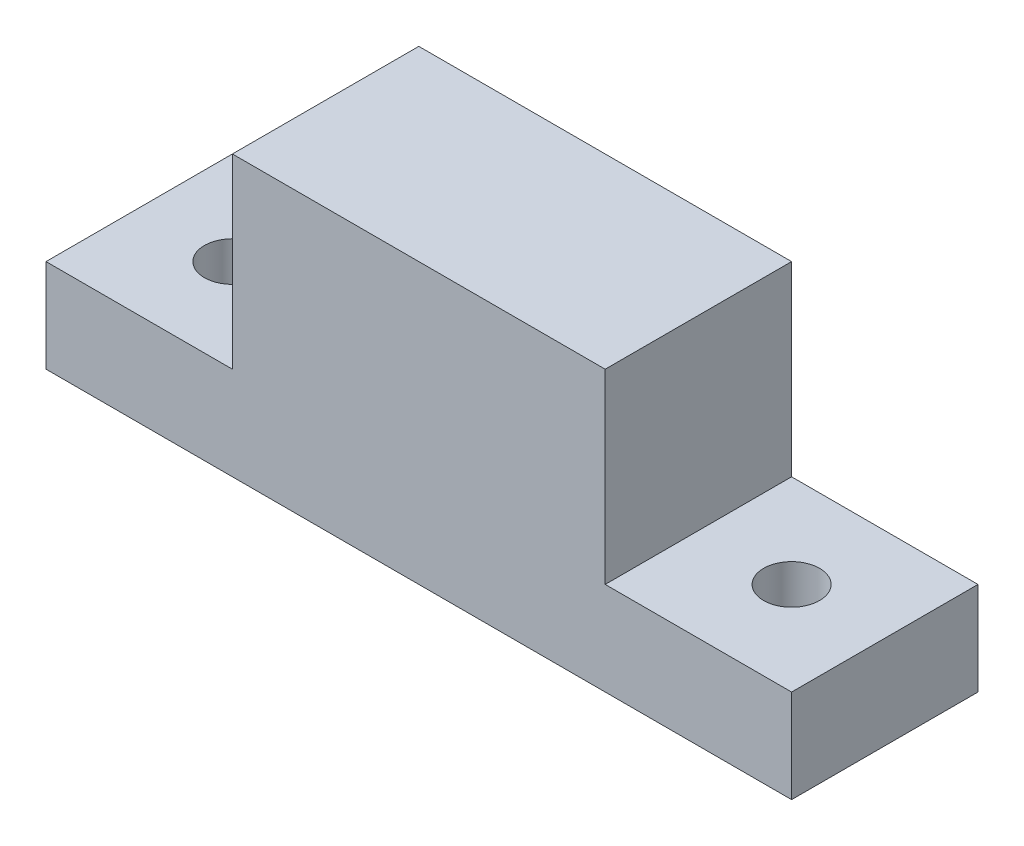
ISO-10303-21;
HEADER;
FILE_DESCRIPTION(('STEP AP214'),'2;1');
FILE_NAME('part.step','',(''),(''),'','','');
FILE_SCHEMA(('AUTOMOTIVE_DESIGN { 1 0 10303 214 1 1 1 1 }'));
ENDSEC;
DATA;
#1=APPLICATION_CONTEXT('core data for automotive mechanical design processes');
#2=APPLICATION_PROTOCOL_DEFINITION('international standard','automotive_design',2000,#1);
#3=PRODUCT_CONTEXT('',#1,'mechanical');
#4=PRODUCT('Part','Part','',(#3));
#5=PRODUCT_RELATED_PRODUCT_CATEGORY('part','',(#4));
#6=PRODUCT_DEFINITION_FORMATION('','',#4);
#7=PRODUCT_DEFINITION_CONTEXT('part definition',#1,'design');
#8=PRODUCT_DEFINITION('design','',#6,#7);
#9=PRODUCT_DEFINITION_SHAPE('','',#8);
#10=(LENGTH_UNIT() NAMED_UNIT(*) SI_UNIT(.MILLI.,.METRE.));
#11=(NAMED_UNIT(*) PLANE_ANGLE_UNIT() SI_UNIT($,.RADIAN.));
#12=(NAMED_UNIT(*) SI_UNIT($,.STERADIAN.) SOLID_ANGLE_UNIT());
#13=UNCERTAINTY_MEASURE_WITH_UNIT(LENGTH_MEASURE(1.E-05),#10,'distance_accuracy_value','');
#14=(GEOMETRIC_REPRESENTATION_CONTEXT(3) GLOBAL_UNCERTAINTY_ASSIGNED_CONTEXT((#13)) GLOBAL_UNIT_ASSIGNED_CONTEXT((#10,
#11,#12)) REPRESENTATION_CONTEXT('',''));
#15=CARTESIAN_POINT('',(0.,0.,0.));
#16=DIRECTION('',(0.,0.,1.));
#17=DIRECTION('',(1.,0.,0.));
#18=AXIS2_PLACEMENT_3D('',#15,#16,#17);
#19=CARTESIAN_POINT('',(0.,0.,0.));
#20=DIRECTION('',(0.,1.,0.));
#21=DIRECTION('',(0.,0.,1.));
#22=AXIS2_PLACEMENT_3D('',#19,#20,#21);
#23=PLANE('',#22);
#24=CARTESIAN_POINT('',(-30.0000000000006,0.,0.));
#25=DIRECTION('',(0.,1.,0.));
#26=DIRECTION('',(0.,0.,1.));
#27=AXIS2_PLACEMENT_3D('',#24,#25,#26);
#28=CIRCLE('',#27,3.);
#29=CARTESIAN_POINT('',(-30.0000000000006,0.,3.));
#30=VERTEX_POINT('',#29);
#31=EDGE_CURVE('E168',#30,#30,#28,.T.);
#32=ORIENTED_EDGE('',*,*,#31,.T.);
#33=EDGE_LOOP('',(#32));
#34=FACE_BOUND('',#33,.T.);
#35=CARTESIAN_POINT('',(-30.0000000000006,0.,0.));
#36=DIRECTION('',(0.,-1.,0.));
#37=DIRECTION('',(0.,0.,-1.));
#38=AXIS2_PLACEMENT_3D('',#35,#36,#37);
#39=CIRCLE('',#38,5.);
#40=CARTESIAN_POINT('',(-30.0000000000006,0.,-5.));
#41=VERTEX_POINT('',#40);
#42=EDGE_CURVE('E135',#41,#41,#39,.T.);
#43=ORIENTED_EDGE('',*,*,#42,.T.);
#44=EDGE_LOOP('',(#43));
#45=FACE_BOUND('',#44,.T.);
#46=ADVANCED_FACE('F41',(#34,#45),#23,.F.);
#47=CARTESIAN_POINT('',(30.0000000000006,0.,0.));
#48=DIRECTION('',(0.,1.,0.));
#49=DIRECTION('',(0.,0.,1.));
#50=AXIS2_PLACEMENT_3D('',#47,#48,#49);
#51=CIRCLE('',#50,3.);
#52=CARTESIAN_POINT('',(30.0000000000006,0.,3.));
#53=VERTEX_POINT('',#52);
#54=EDGE_CURVE('E164',#53,#53,#51,.T.);
#55=ORIENTED_EDGE('',*,*,#54,.T.);
#56=EDGE_LOOP('',(#55));
#57=FACE_BOUND('',#56,.T.);
#58=CARTESIAN_POINT('',(30.0000000000006,0.,0.));
#59=DIRECTION('',(0.,-1.,0.));
#60=DIRECTION('',(0.,0.,-1.));
#61=AXIS2_PLACEMENT_3D('',#58,#59,#60);
#62=CIRCLE('',#61,5.);
#63=CARTESIAN_POINT('',(30.0000000000006,0.,-5.));
#64=VERTEX_POINT('',#63);
#65=EDGE_CURVE('E228',#64,#64,#62,.T.);
#66=ORIENTED_EDGE('',*,*,#65,.T.);
#67=EDGE_LOOP('',(#66));
#68=FACE_BOUND('',#67,.T.);
#69=ADVANCED_FACE('F220',(#57,#68),#23,.F.);
#70=CARTESIAN_POINT('',(0.,5.,0.));
#71=DIRECTION('',(0.,1.,0.));
#72=DIRECTION('',(0.,0.,1.));
#73=AXIS2_PLACEMENT_3D('',#70,#71,#72);
#74=PLANE('',#73);
#75=DIRECTION('',(0.,0.,-1.));
#76=VECTOR('',#75,1.);
#77=CARTESIAN_POINT('',(20.,5.,-10.));
#78=LINE('',#77,#76);
#79=CARTESIAN_POINT('',(20.,5.,10.));
#80=VERTEX_POINT('',#79);
#81=CARTESIAN_POINT('',(20.,5.,-10.));
#82=VERTEX_POINT('',#81);
#83=EDGE_CURVE('E56',#80,#82,#78,.T.);
#84=ORIENTED_EDGE('',*,*,#83,.F.);
#85=DIRECTION('',(1.,0.,0.));
#86=VECTOR('',#85,1.);
#87=CARTESIAN_POINT('',(-40.,5.,10.));
#88=LINE('',#87,#86);
#89=CARTESIAN_POINT('',(40.,5.,10.));
#90=VERTEX_POINT('',#89);
#91=EDGE_CURVE('E182',#80,#90,#88,.T.);
#92=ORIENTED_EDGE('',*,*,#91,.T.);
#93=DIRECTION('',(0.,0.,-1.));
#94=VECTOR('',#93,1.);
#95=CARTESIAN_POINT('',(40.,5.,-10.));
#96=LINE('',#95,#94);
#97=CARTESIAN_POINT('',(40.,5.,-10.));
#98=VERTEX_POINT('',#97);
#99=EDGE_CURVE('E112',#90,#98,#96,.T.);
#100=ORIENTED_EDGE('',*,*,#99,.T.);
#101=DIRECTION('',(-1.,0.,0.));
#102=VECTOR('',#101,1.);
#103=CARTESIAN_POINT('',(-40.,5.,-10.));
#104=LINE('',#103,#102);
#105=EDGE_CURVE('E178',#98,#82,#104,.T.);
#106=ORIENTED_EDGE('',*,*,#105,.T.);
#107=EDGE_LOOP('',(#84,#92,#100,#106));
#108=FACE_BOUND('',#107,.T.);
#109=CARTESIAN_POINT('',(30.0000000000006,5.,0.));
#110=DIRECTION('',(0.,1.,0.));
#111=DIRECTION('',(0.,0.,1.));
#112=AXIS2_PLACEMENT_3D('',#109,#110,#111);
#113=CIRCLE('',#112,3.);
#114=CARTESIAN_POINT('',(30.0000000000006,5.,3.));
#115=VERTEX_POINT('',#114);
#116=EDGE_CURVE('E165',#115,#115,#113,.T.);
#117=ORIENTED_EDGE('',*,*,#116,.F.);
#118=EDGE_LOOP('',(#117));
#119=FACE_BOUND('',#118,.T.);
#120=ADVANCED_FACE('F191',(#108,#119),#74,.T.);
#121=DIRECTION('',(0.,0.,1.));
#122=VECTOR('',#121,1.);
#123=CARTESIAN_POINT('',(-20.,5.,-10.));
#124=LINE('',#123,#122);
#125=CARTESIAN_POINT('',(-20.,5.,-10.));
#126=VERTEX_POINT('',#125);
#127=CARTESIAN_POINT('',(-20.,5.,10.));
#128=VERTEX_POINT('',#127);
#129=EDGE_CURVE('E64',#126,#128,#124,.T.);
#130=ORIENTED_EDGE('',*,*,#129,.F.);
#131=CARTESIAN_POINT('',(-40.,5.,-10.));
#132=VERTEX_POINT('',#131);
#133=EDGE_CURVE('E177',#126,#132,#104,.T.);
#134=ORIENTED_EDGE('',*,*,#133,.T.);
#135=DIRECTION('',(0.,0.,1.));
#136=VECTOR('',#135,1.);
#137=CARTESIAN_POINT('',(-40.,5.,-10.));
#138=LINE('',#137,#136);
#139=CARTESIAN_POINT('',(-40.,5.,10.));
#140=VERTEX_POINT('',#139);
#141=EDGE_CURVE('E180',#132,#140,#138,.T.);
#142=ORIENTED_EDGE('',*,*,#141,.T.);
#143=EDGE_CURVE('E115',#140,#128,#88,.T.);
#144=ORIENTED_EDGE('',*,*,#143,.T.);
#145=EDGE_LOOP('',(#130,#134,#142,#144));
#146=FACE_BOUND('',#145,.T.);
#147=CARTESIAN_POINT('',(-30.0000000000006,5.,0.));
#148=DIRECTION('',(0.,1.,0.));
#149=DIRECTION('',(0.,0.,1.));
#150=AXIS2_PLACEMENT_3D('',#147,#148,#149);
#151=CIRCLE('',#150,3.);
#152=CARTESIAN_POINT('',(-30.0000000000006,5.,3.));
#153=VERTEX_POINT('',#152);
#154=EDGE_CURVE('E171',#153,#153,#151,.T.);
#155=ORIENTED_EDGE('',*,*,#154,.F.);
#156=EDGE_LOOP('',(#155));
#157=FACE_BOUND('',#156,.T.);
#158=ADVANCED_FACE('F205',(#146,#157),#74,.T.);
#159=CARTESIAN_POINT('',(40.,5.,-10.));
#160=DIRECTION('',(-1.,0.,0.));
#161=DIRECTION('',(0.,0.,1.));
#162=AXIS2_PLACEMENT_3D('',#159,#160,#161);
#163=PLANE('',#162);
#164=DIRECTION('',(0.,-1.,0.));
#165=VECTOR('',#164,1.);
#166=CARTESIAN_POINT('',(40.,5.,10.));
#167=LINE('',#166,#165);
#168=CARTESIAN_POINT('',(40.,-5.,10.));
#169=VERTEX_POINT('',#168);
#170=EDGE_CURVE('E106',#90,#169,#167,.T.);
#171=ORIENTED_EDGE('',*,*,#170,.T.);
#172=DIRECTION('',(0.,0.,1.));
#173=VECTOR('',#172,1.);
#174=CARTESIAN_POINT('',(40.,-5.,10.));
#175=LINE('',#174,#173);
#176=CARTESIAN_POINT('',(40.,-5.,-10.));
#177=VERTEX_POINT('',#176);
#178=EDGE_CURVE('E110',#177,#169,#175,.T.);
#179=ORIENTED_EDGE('',*,*,#178,.F.);
#180=DIRECTION('',(0.,-1.,0.));
#181=VECTOR('',#180,1.);
#182=CARTESIAN_POINT('',(40.,5.,-10.));
#183=LINE('',#182,#181);
#184=EDGE_CURVE('E11',#98,#177,#183,.T.);
#185=ORIENTED_EDGE('',*,*,#184,.F.);
#186=ORIENTED_EDGE('',*,*,#99,.F.);
#187=EDGE_LOOP('',(#171,#179,#185,#186));
#188=FACE_BOUND('',#187,.T.);
#189=ADVANCED_FACE('F43',(#188),#163,.F.);
#190=CARTESIAN_POINT('',(-40.,5.,-10.));
#191=DIRECTION('',(0.,0.,1.));
#192=DIRECTION('',(1.,0.,0.));
#193=AXIS2_PLACEMENT_3D('',#190,#191,#192);
#194=PLANE('',#193);
#195=ORIENTED_EDGE('',*,*,#184,.T.);
#196=DIRECTION('',(1.,0.,0.));
#197=VECTOR('',#196,1.);
#198=CARTESIAN_POINT('',(-40.,-5.,-10.));
#199=LINE('',#198,#197);
#200=CARTESIAN_POINT('',(-40.,-5.,-10.));
#201=VERTEX_POINT('',#200);
#202=EDGE_CURVE('E131',#201,#177,#199,.T.);
#203=ORIENTED_EDGE('',*,*,#202,.F.);
#204=DIRECTION('',(0.,-1.,0.));
#205=VECTOR('',#204,1.);
#206=CARTESIAN_POINT('',(-40.,5.,-10.));
#207=LINE('',#206,#205);
#208=EDGE_CURVE('E49',#132,#201,#207,.T.);
#209=ORIENTED_EDGE('',*,*,#208,.F.);
#210=ORIENTED_EDGE('',*,*,#133,.F.);
#211=DIRECTION('',(0.,-1.,0.));
#212=VECTOR('',#211,1.);
#213=CARTESIAN_POINT('',(-20.,25.,-10.));
#214=LINE('',#213,#212);
#215=CARTESIAN_POINT('',(-20.,25.,-10.));
#216=VERTEX_POINT('',#215);
#217=EDGE_CURVE('E158',#216,#126,#214,.T.);
#218=ORIENTED_EDGE('',*,*,#217,.F.);
#219=DIRECTION('',(-1.,0.,0.));
#220=VECTOR('',#219,1.);
#221=CARTESIAN_POINT('',(-20.,25.,-10.));
#222=LINE('',#221,#220);
#223=CARTESIAN_POINT('',(20.,25.,-10.));
#224=VERTEX_POINT('',#223);
#225=EDGE_CURVE('E144',#224,#216,#222,.T.);
#226=ORIENTED_EDGE('',*,*,#225,.F.);
#227=DIRECTION('',(0.,-1.,0.));
#228=VECTOR('',#227,1.);
#229=CARTESIAN_POINT('',(20.,25.,-10.));
#230=LINE('',#229,#228);
#231=EDGE_CURVE('E161',#224,#82,#230,.T.);
#232=ORIENTED_EDGE('',*,*,#231,.T.);
#233=ORIENTED_EDGE('',*,*,#105,.F.);
#234=EDGE_LOOP('',(#195,#203,#209,#210,#218,#226,#232,#233));
#235=FACE_BOUND('',#234,.T.);
#236=ADVANCED_FACE('F189',(#235),#194,.F.);
#237=CARTESIAN_POINT('',(-40.,5.,-10.));
#238=DIRECTION('',(1.,0.,0.));
#239=DIRECTION('',(0.,0.,-1.));
#240=AXIS2_PLACEMENT_3D('',#237,#238,#239);
#241=PLANE('',#240);
#242=ORIENTED_EDGE('',*,*,#208,.T.);
#243=DIRECTION('',(0.,0.,-1.));
#244=VECTOR('',#243,1.);
#245=CARTESIAN_POINT('',(-40.,-5.,10.));
#246=LINE('',#245,#244);
#247=CARTESIAN_POINT('',(-40.,-5.,10.));
#248=VERTEX_POINT('',#247);
#249=EDGE_CURVE('E125',#248,#201,#246,.T.);
#250=ORIENTED_EDGE('',*,*,#249,.F.);
#251=DIRECTION('',(0.,-1.,0.));
#252=VECTOR('',#251,1.);
#253=CARTESIAN_POINT('',(-40.,5.,10.));
#254=LINE('',#253,#252);
#255=EDGE_CURVE('E114',#140,#248,#254,.T.);
#256=ORIENTED_EDGE('',*,*,#255,.F.);
#257=ORIENTED_EDGE('',*,*,#141,.F.);
#258=EDGE_LOOP('',(#242,#250,#256,#257));
#259=FACE_BOUND('',#258,.T.);
#260=ADVANCED_FACE('F187',(#259),#241,.F.);
#261=CARTESIAN_POINT('',(-40.,5.,10.));
#262=DIRECTION('',(0.,0.,-1.));
#263=DIRECTION('',(-1.,0.,0.));
#264=AXIS2_PLACEMENT_3D('',#261,#262,#263);
#265=PLANE('',#264);
#266=ORIENTED_EDGE('',*,*,#255,.T.);
#267=DIRECTION('',(-1.,0.,0.));
#268=VECTOR('',#267,1.);
#269=CARTESIAN_POINT('',(-40.,-5.,10.));
#270=LINE('',#269,#268);
#271=EDGE_CURVE('E118',#169,#248,#270,.T.);
#272=ORIENTED_EDGE('',*,*,#271,.F.);
#273=ORIENTED_EDGE('',*,*,#170,.F.);
#274=ORIENTED_EDGE('',*,*,#91,.F.);
#275=DIRECTION('',(0.,-1.,0.));
#276=VECTOR('',#275,1.);
#277=CARTESIAN_POINT('',(20.,25.,10.));
#278=LINE('',#277,#276);
#279=CARTESIAN_POINT('',(20.,25.,10.));
#280=VERTEX_POINT('',#279);
#281=EDGE_CURVE('E150',#280,#80,#278,.T.);
#282=ORIENTED_EDGE('',*,*,#281,.F.);
#283=DIRECTION('',(1.,0.,0.));
#284=VECTOR('',#283,1.);
#285=CARTESIAN_POINT('',(-20.,25.,10.));
#286=LINE('',#285,#284);
#287=CARTESIAN_POINT('',(-20.,25.,10.));
#288=VERTEX_POINT('',#287);
#289=EDGE_CURVE('E148',#288,#280,#286,.T.);
#290=ORIENTED_EDGE('',*,*,#289,.F.);
#291=DIRECTION('',(0.,-1.,0.));
#292=VECTOR('',#291,1.);
#293=CARTESIAN_POINT('',(-20.,25.,10.));
#294=LINE('',#293,#292);
#295=EDGE_CURVE('E155',#288,#128,#294,.T.);
#296=ORIENTED_EDGE('',*,*,#295,.T.);
#297=ORIENTED_EDGE('',*,*,#143,.F.);
#298=EDGE_LOOP('',(#266,#272,#273,#274,#282,#290,#296,#297));
#299=FACE_BOUND('',#298,.T.);
#300=ADVANCED_FACE('F119',(#299),#265,.F.);
#301=CARTESIAN_POINT('',(-30.0000000000006,5.,0.));
#302=DIRECTION('',(0.,-1.,0.));
#303=DIRECTION('',(0.,0.,-1.));
#304=AXIS2_PLACEMENT_3D('',#301,#302,#303);
#305=CYLINDRICAL_SURFACE('',#304,3.);
#306=ORIENTED_EDGE('',*,*,#154,.T.);
#307=EDGE_LOOP('',(#306));
#308=FACE_BOUND('',#307,.T.);
#309=ORIENTED_EDGE('',*,*,#31,.F.);
#310=EDGE_LOOP('',(#309));
#311=FACE_BOUND('',#310,.T.);
#312=ADVANCED_FACE('F211',(#308,#311),#305,.F.);
#313=CARTESIAN_POINT('',(30.0000000000006,5.,0.));
#314=DIRECTION('',(0.,-1.,0.));
#315=DIRECTION('',(0.,0.,-1.));
#316=AXIS2_PLACEMENT_3D('',#313,#314,#315);
#317=CYLINDRICAL_SURFACE('',#316,3.);
#318=ORIENTED_EDGE('',*,*,#116,.T.);
#319=EDGE_LOOP('',(#318));
#320=FACE_BOUND('',#319,.T.);
#321=ORIENTED_EDGE('',*,*,#54,.F.);
#322=EDGE_LOOP('',(#321));
#323=FACE_BOUND('',#322,.T.);
#324=ADVANCED_FACE('F214',(#320,#323),#317,.F.);
#325=CARTESIAN_POINT('',(20.,25.,-10.));
#326=DIRECTION('',(-1.,0.,0.));
#327=DIRECTION('',(0.,0.,1.));
#328=AXIS2_PLACEMENT_3D('',#325,#326,#327);
#329=PLANE('',#328);
#330=ORIENTED_EDGE('',*,*,#83,.T.);
#331=ORIENTED_EDGE('',*,*,#231,.F.);
#332=DIRECTION('',(0.,0.,-1.));
#333=VECTOR('',#332,1.);
#334=CARTESIAN_POINT('',(20.,25.,-10.));
#335=LINE('',#334,#333);
#336=EDGE_CURVE('E141',#280,#224,#335,.T.);
#337=ORIENTED_EDGE('',*,*,#336,.F.);
#338=ORIENTED_EDGE('',*,*,#281,.T.);
#339=EDGE_LOOP('',(#330,#331,#337,#338));
#340=FACE_BOUND('',#339,.T.);
#341=ADVANCED_FACE('F197',(#340),#329,.F.);
#342=CARTESIAN_POINT('',(-20.,25.,-10.));
#343=DIRECTION('',(1.,0.,0.));
#344=DIRECTION('',(0.,0.,-1.));
#345=AXIS2_PLACEMENT_3D('',#342,#343,#344);
#346=PLANE('',#345);
#347=ORIENTED_EDGE('',*,*,#129,.T.);
#348=ORIENTED_EDGE('',*,*,#295,.F.);
#349=DIRECTION('',(0.,0.,1.));
#350=VECTOR('',#349,1.);
#351=CARTESIAN_POINT('',(-20.,25.,-10.));
#352=LINE('',#351,#350);
#353=EDGE_CURVE('E146',#216,#288,#352,.T.);
#354=ORIENTED_EDGE('',*,*,#353,.F.);
#355=ORIENTED_EDGE('',*,*,#217,.T.);
#356=EDGE_LOOP('',(#347,#348,#354,#355));
#357=FACE_BOUND('',#356,.T.);
#358=ADVANCED_FACE('F204',(#357),#346,.F.);
#359=CARTESIAN_POINT('',(0.,25.,0.));
#360=DIRECTION('',(0.,1.,0.));
#361=DIRECTION('',(0.,0.,1.));
#362=AXIS2_PLACEMENT_3D('',#359,#360,#361);
#363=PLANE('',#362);
#364=ORIENTED_EDGE('',*,*,#336,.T.);
#365=ORIENTED_EDGE('',*,*,#225,.T.);
#366=ORIENTED_EDGE('',*,*,#353,.T.);
#367=ORIENTED_EDGE('',*,*,#289,.T.);
#368=EDGE_LOOP('',(#364,#365,#366,#367));
#369=FACE_BOUND('',#368,.T.);
#370=ADVANCED_FACE('F199',(#369),#363,.T.);
#371=CARTESIAN_POINT('',(0.,-5.,0.));
#372=DIRECTION('',(0.,-1.,0.));
#373=DIRECTION('',(0.,0.,-1.));
#374=AXIS2_PLACEMENT_3D('',#371,#372,#373);
#375=PLANE('',#374);
#376=CARTESIAN_POINT('',(30.0000000000006,-5.,0.));
#377=DIRECTION('',(0.,-1.,0.));
#378=DIRECTION('',(0.,0.,-1.));
#379=AXIS2_PLACEMENT_3D('',#376,#377,#378);
#380=CIRCLE('',#379,5.);
#381=CARTESIAN_POINT('',(30.0000000000006,-5.,-5.));
#382=VERTEX_POINT('',#381);
#383=EDGE_CURVE('E226',#382,#382,#380,.T.);
#384=ORIENTED_EDGE('',*,*,#383,.F.);
#385=EDGE_LOOP('',(#384));
#386=FACE_BOUND('',#385,.T.);
#387=ORIENTED_EDGE('',*,*,#178,.T.);
#388=ORIENTED_EDGE('',*,*,#271,.T.);
#389=ORIENTED_EDGE('',*,*,#249,.T.);
#390=ORIENTED_EDGE('',*,*,#202,.T.);
#391=EDGE_LOOP('',(#387,#388,#389,#390));
#392=FACE_BOUND('',#391,.T.);
#393=CARTESIAN_POINT('',(-30.0000000000006,-5.,0.));
#394=DIRECTION('',(0.,-1.,0.));
#395=DIRECTION('',(0.,0.,-1.));
#396=AXIS2_PLACEMENT_3D('',#393,#394,#395);
#397=CIRCLE('',#396,5.);
#398=CARTESIAN_POINT('',(-30.0000000000006,-5.,-5.));
#399=VERTEX_POINT('',#398);
#400=EDGE_CURVE('E132',#399,#399,#397,.T.);
#401=ORIENTED_EDGE('',*,*,#400,.F.);
#402=EDGE_LOOP('',(#401));
#403=FACE_BOUND('',#402,.T.);
#404=CARTESIAN_POINT('',(0.,-5.,0.));
#405=DIRECTION('',(0.,-1.,0.));
#406=DIRECTION('',(0.,0.,-1.));
#407=AXIS2_PLACEMENT_3D('',#404,#405,#406);
#408=CIRCLE('',#407,2.5);
#409=CARTESIAN_POINT('',(0.,-5.,-2.5));
#410=VERTEX_POINT('',#409);
#411=EDGE_CURVE('E233',#410,#410,#408,.T.);
#412=ORIENTED_EDGE('',*,*,#411,.F.);
#413=EDGE_LOOP('',(#412));
#414=FACE_BOUND('',#413,.T.);
#415=ADVANCED_FACE('F128',(#386,#392,#403,#414),#375,.T.);
#416=CARTESIAN_POINT('',(-30.0000000000006,-5.,0.));
#417=DIRECTION('',(0.,1.,0.));
#418=DIRECTION('',(0.,0.,1.));
#419=AXIS2_PLACEMENT_3D('',#416,#417,#418);
#420=CYLINDRICAL_SURFACE('',#419,5.);
#421=ORIENTED_EDGE('',*,*,#400,.T.);
#422=EDGE_LOOP('',(#421));
#423=FACE_BOUND('',#422,.T.);
#424=ORIENTED_EDGE('',*,*,#42,.F.);
#425=EDGE_LOOP('',(#424));
#426=FACE_BOUND('',#425,.T.);
#427=ADVANCED_FACE('F246',(#423,#426),#420,.F.);
#428=CARTESIAN_POINT('',(30.0000000000006,-5.,0.));
#429=DIRECTION('',(0.,1.,0.));
#430=DIRECTION('',(0.,0.,1.));
#431=AXIS2_PLACEMENT_3D('',#428,#429,#430);
#432=CYLINDRICAL_SURFACE('',#431,5.);
#433=ORIENTED_EDGE('',*,*,#383,.T.);
#434=EDGE_LOOP('',(#433));
#435=FACE_BOUND('',#434,.T.);
#436=ORIENTED_EDGE('',*,*,#65,.F.);
#437=EDGE_LOOP('',(#436));
#438=FACE_BOUND('',#437,.T.);
#439=ADVANCED_FACE('F253',(#435,#438),#432,.F.);
#440=CARTESIAN_POINT('',(0.,-5.,0.));
#441=DIRECTION('',(0.,1.,0.));
#442=DIRECTION('',(0.,0.,1.));
#443=AXIS2_PLACEMENT_3D('',#440,#441,#442);
#444=CYLINDRICAL_SURFACE('',#443,2.5);
#445=ORIENTED_EDGE('',*,*,#411,.T.);
#446=EDGE_LOOP('',(#445));
#447=FACE_BOUND('',#446,.T.);
#448=CARTESIAN_POINT('',(0.,0.,0.));
#449=DIRECTION('',(0.,-1.,0.));
#450=DIRECTION('',(0.,0.,-1.));
#451=AXIS2_PLACEMENT_3D('',#448,#449,#450);
#452=CIRCLE('',#451,2.5);
#453=CARTESIAN_POINT('',(0.,0.,-2.5));
#454=VERTEX_POINT('',#453);
#455=EDGE_CURVE('E236',#454,#454,#452,.T.);
#456=ORIENTED_EDGE('',*,*,#455,.F.);
#457=EDGE_LOOP('',(#456));
#458=FACE_BOUND('',#457,.T.);
#459=ADVANCED_FACE('F242',(#447,#458),#444,.F.);
#460=ORIENTED_EDGE('',*,*,#455,.T.);
#461=EDGE_LOOP('',(#460));
#462=FACE_BOUND('',#461,.T.);
#463=ADVANCED_FACE('F222',(#462),#23,.F.);
#464=CLOSED_SHELL('',(#46,#69,#120,#158,#189,#236,#260,#300,#312,#324,#341,#358,#370,#415,#427,
#439,#459,#463));
#465=MANIFOLD_SOLID_BREP('B2',#464);
#466=ADVANCED_BREP_SHAPE_REPRESENTATION('',(#18,#465),#14);
#467=SHAPE_DEFINITION_REPRESENTATION(#9,#466);
ENDSEC;
END-ISO-10303-21;
